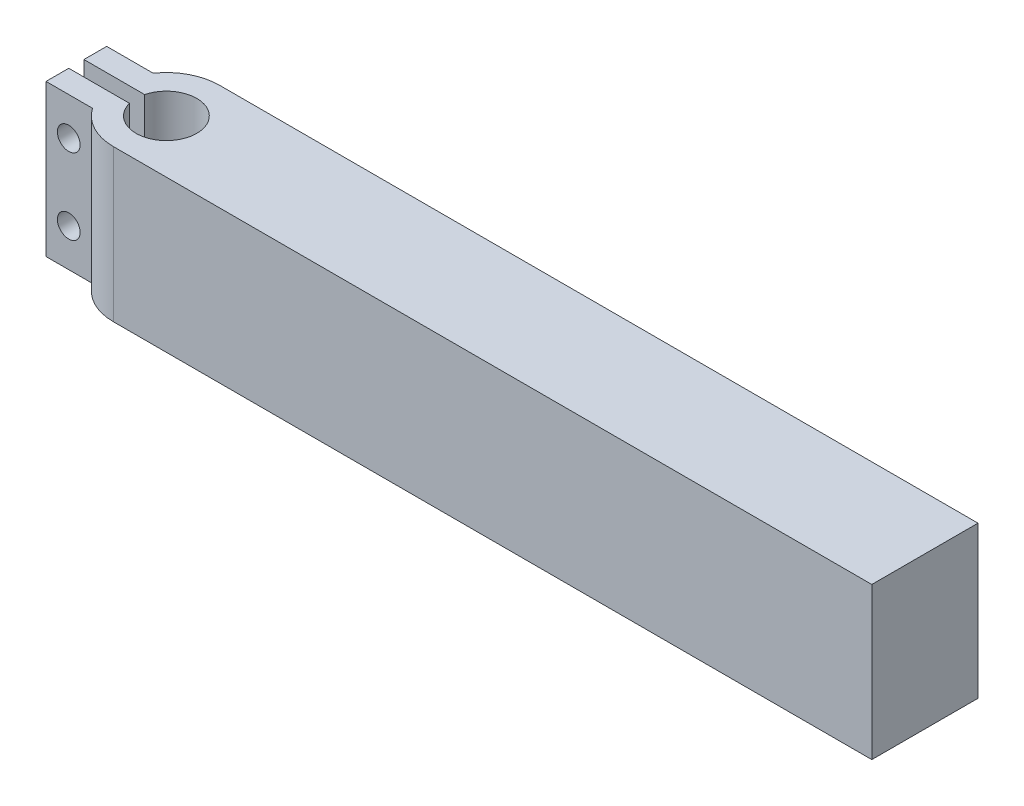
ISO-10303-21;
HEADER;
FILE_DESCRIPTION(('STEP AP214'),'2;1');
FILE_NAME('part.step','',(''),(''),'','','');
FILE_SCHEMA(('AUTOMOTIVE_DESIGN { 1 0 10303 214 1 1 1 1 }'));
ENDSEC;
DATA;
#1=APPLICATION_CONTEXT('core data for automotive mechanical design processes');
#2=APPLICATION_PROTOCOL_DEFINITION('international standard','automotive_design',2000,#1);
#3=PRODUCT_CONTEXT('',#1,'mechanical');
#4=PRODUCT('Part','Part','',(#3));
#5=PRODUCT_RELATED_PRODUCT_CATEGORY('part','',(#4));
#6=PRODUCT_DEFINITION_FORMATION('','',#4);
#7=PRODUCT_DEFINITION_CONTEXT('part definition',#1,'design');
#8=PRODUCT_DEFINITION('design','',#6,#7);
#9=PRODUCT_DEFINITION_SHAPE('','',#8);
#10=(LENGTH_UNIT() NAMED_UNIT(*) SI_UNIT(.MILLI.,.METRE.));
#11=(NAMED_UNIT(*) PLANE_ANGLE_UNIT() SI_UNIT($,.RADIAN.));
#12=(NAMED_UNIT(*) SI_UNIT($,.STERADIAN.) SOLID_ANGLE_UNIT());
#13=UNCERTAINTY_MEASURE_WITH_UNIT(LENGTH_MEASURE(1.E-05),#10,'distance_accuracy_value','');
#14=(GEOMETRIC_REPRESENTATION_CONTEXT(3) GLOBAL_UNCERTAINTY_ASSIGNED_CONTEXT((#13)) GLOBAL_UNIT_ASSIGNED_CONTEXT((#10,
#11,#12)) REPRESENTATION_CONTEXT('',''));
#15=CARTESIAN_POINT('',(0.,0.,0.));
#16=DIRECTION('',(0.,0.,1.));
#17=DIRECTION('',(1.,0.,0.));
#18=AXIS2_PLACEMENT_3D('',#15,#16,#17);
#19=CARTESIAN_POINT('',(0.,20.,-7.));
#20=DIRECTION('',(0.,-1.,0.));
#21=DIRECTION('',(0.,0.,-1.));
#22=AXIS2_PLACEMENT_3D('',#19,#20,#21);
#23=CYLINDRICAL_SURFACE('',#22,7.);
#24=CARTESIAN_POINT('',(0.,20.,-7.));
#25=DIRECTION('',(0.,1.,0.));
#26=DIRECTION('',(0.,0.,1.));
#27=AXIS2_PLACEMENT_3D('',#24,#25,#26);
#28=CIRCLE('',#27,7.);
#29=CARTESIAN_POINT('',(-5.74456264653803,20.,-3.));
#30=VERTEX_POINT('',#29);
#31=CARTESIAN_POINT('',(0.,20.,0.));
#32=VERTEX_POINT('',#31);
#33=EDGE_CURVE('E188',#30,#32,#28,.T.);
#34=ORIENTED_EDGE('',*,*,#33,.F.);
#35=DIRECTION('',(0.,-1.,0.));
#36=VECTOR('',#35,1.);
#37=CARTESIAN_POINT('',(-5.74456264653803,20.,-3.));
#38=LINE('',#37,#36);
#39=CARTESIAN_POINT('',(-5.74456264653803,0.,-3.));
#40=VERTEX_POINT('',#39);
#41=EDGE_CURVE('E153',#30,#40,#38,.T.);
#42=ORIENTED_EDGE('',*,*,#41,.T.);
#43=CARTESIAN_POINT('',(0.,0.,-7.));
#44=DIRECTION('',(0.,1.,0.));
#45=DIRECTION('',(0.,0.,1.));
#46=AXIS2_PLACEMENT_3D('',#43,#44,#45);
#47=CIRCLE('',#46,7.);
#48=CARTESIAN_POINT('',(0.,0.,0.));
#49=VERTEX_POINT('',#48);
#50=EDGE_CURVE('E200',#40,#49,#47,.T.);
#51=ORIENTED_EDGE('',*,*,#50,.T.);
#52=DIRECTION('',(0.,-1.,0.));
#53=VECTOR('',#52,1.);
#54=CARTESIAN_POINT('',(0.,20.,0.));
#55=LINE('',#54,#53);
#56=EDGE_CURVE('E212',#32,#49,#55,.T.);
#57=ORIENTED_EDGE('',*,*,#56,.F.);
#58=EDGE_LOOP('',(#34,#42,#51,#57));
#59=FACE_BOUND('',#58,.T.);
#60=ADVANCED_FACE('F35',(#59),#23,.T.);
#61=CARTESIAN_POINT('',(0.,20.,-14.));
#62=DIRECTION('',(0.,0.,-1.));
#63=DIRECTION('',(-1.,0.,0.));
#64=AXIS2_PLACEMENT_3D('',#61,#62,#63);
#65=PLANE('',#64);
#66=DIRECTION('',(1.,0.,0.));
#67=VECTOR('',#66,1.);
#68=CARTESIAN_POINT('',(0.,0.,-14.));
#69=LINE('',#68,#67);
#70=CARTESIAN_POINT('',(0.,0.,-14.));
#71=VERTEX_POINT('',#70);
#72=CARTESIAN_POINT('',(100.,0.,-14.));
#73=VERTEX_POINT('',#72);
#74=EDGE_CURVE('E182',#71,#73,#69,.T.);
#75=ORIENTED_EDGE('',*,*,#74,.F.);
#76=DIRECTION('',(0.,-1.,0.));
#77=VECTOR('',#76,1.);
#78=CARTESIAN_POINT('',(0.,20.,-14.));
#79=LINE('',#78,#77);
#80=CARTESIAN_POINT('',(0.,20.,-14.));
#81=VERTEX_POINT('',#80);
#82=EDGE_CURVE('E215',#81,#71,#79,.T.);
#83=ORIENTED_EDGE('',*,*,#82,.F.);
#84=DIRECTION('',(1.,0.,0.));
#85=VECTOR('',#84,1.);
#86=CARTESIAN_POINT('',(0.,20.,-14.));
#87=LINE('',#86,#85);
#88=CARTESIAN_POINT('',(100.,20.,-14.));
#89=VERTEX_POINT('',#88);
#90=EDGE_CURVE('E185',#81,#89,#87,.T.);
#91=ORIENTED_EDGE('',*,*,#90,.T.);
#92=DIRECTION('',(0.,-1.,0.));
#93=VECTOR('',#92,1.);
#94=CARTESIAN_POINT('',(100.,20.,-14.));
#95=LINE('',#94,#93);
#96=EDGE_CURVE('E197',#89,#73,#95,.T.);
#97=ORIENTED_EDGE('',*,*,#96,.T.);
#98=EDGE_LOOP('',(#75,#83,#91,#97));
#99=FACE_BOUND('',#98,.T.);
#100=ADVANCED_FACE('F37',(#99),#65,.T.);
#101=CARTESIAN_POINT('',(-5.74456264653803,0.,-11.));
#102=VERTEX_POINT('',#101);
#103=EDGE_CURVE('E201',#71,#102,#47,.T.);
#104=ORIENTED_EDGE('',*,*,#103,.T.);
#105=DIRECTION('',(0.,-1.,0.));
#106=VECTOR('',#105,1.);
#107=CARTESIAN_POINT('',(-5.74456264653803,20.,-11.));
#108=LINE('',#107,#106);
#109=CARTESIAN_POINT('',(-5.74456264653803,20.,-11.));
#110=VERTEX_POINT('',#109);
#111=EDGE_CURVE('E171',#102,#110,#108,.F.);
#112=ORIENTED_EDGE('',*,*,#111,.T.);
#113=EDGE_CURVE('E190',#81,#110,#28,.T.);
#114=ORIENTED_EDGE('',*,*,#113,.F.);
#115=ORIENTED_EDGE('',*,*,#82,.T.);
#116=EDGE_LOOP('',(#104,#112,#114,#115));
#117=FACE_BOUND('',#116,.T.);
#118=ADVANCED_FACE('F235',(#117),#23,.T.);
#119=CARTESIAN_POINT('',(0.,20.,0.));
#120=DIRECTION('',(0.,0.,-1.));
#121=DIRECTION('',(-1.,0.,0.));
#122=AXIS2_PLACEMENT_3D('',#119,#120,#121);
#123=PLANE('',#122);
#124=DIRECTION('',(1.,0.,0.));
#125=VECTOR('',#124,1.);
#126=CARTESIAN_POINT('',(0.,0.,0.));
#127=LINE('',#126,#125);
#128=CARTESIAN_POINT('',(100.,0.,0.));
#129=VERTEX_POINT('',#128);
#130=EDGE_CURVE('E204',#49,#129,#127,.T.);
#131=ORIENTED_EDGE('',*,*,#130,.T.);
#132=DIRECTION('',(0.,-1.,0.));
#133=VECTOR('',#132,1.);
#134=CARTESIAN_POINT('',(100.,20.,0.));
#135=LINE('',#134,#133);
#136=CARTESIAN_POINT('',(100.,20.,0.));
#137=VERTEX_POINT('',#136);
#138=EDGE_CURVE('E209',#137,#129,#135,.T.);
#139=ORIENTED_EDGE('',*,*,#138,.F.);
#140=DIRECTION('',(1.,0.,0.));
#141=VECTOR('',#140,1.);
#142=CARTESIAN_POINT('',(0.,20.,0.));
#143=LINE('',#142,#141);
#144=EDGE_CURVE('E193',#32,#137,#143,.T.);
#145=ORIENTED_EDGE('',*,*,#144,.F.);
#146=ORIENTED_EDGE('',*,*,#56,.T.);
#147=EDGE_LOOP('',(#131,#139,#145,#146));
#148=FACE_BOUND('',#147,.T.);
#149=ADVANCED_FACE('F248',(#148),#123,.F.);
#150=CARTESIAN_POINT('',(100.,20.,0.));
#151=DIRECTION('',(-1.,0.,0.));
#152=DIRECTION('',(0.,0.,1.));
#153=AXIS2_PLACEMENT_3D('',#150,#151,#152);
#154=PLANE('',#153);
#155=DIRECTION('',(0.,0.,-1.));
#156=VECTOR('',#155,1.);
#157=CARTESIAN_POINT('',(100.,0.,0.));
#158=LINE('',#157,#156);
#159=EDGE_CURVE('E189',#129,#73,#158,.T.);
#160=ORIENTED_EDGE('',*,*,#159,.T.);
#161=ORIENTED_EDGE('',*,*,#96,.F.);
#162=DIRECTION('',(0.,0.,-1.));
#163=VECTOR('',#162,1.);
#164=CARTESIAN_POINT('',(100.,20.,0.));
#165=LINE('',#164,#163);
#166=EDGE_CURVE('E195',#137,#89,#165,.T.);
#167=ORIENTED_EDGE('',*,*,#166,.F.);
#168=ORIENTED_EDGE('',*,*,#138,.T.);
#169=EDGE_LOOP('',(#160,#161,#167,#168));
#170=FACE_BOUND('',#169,.T.);
#171=ADVANCED_FACE('F243',(#170),#154,.F.);
#172=CARTESIAN_POINT('',(0.,20.,0.));
#173=DIRECTION('',(0.,1.,0.));
#174=DIRECTION('',(0.,0.,1.));
#175=AXIS2_PLACEMENT_3D('',#172,#173,#174);
#176=PLANE('',#175);
#177=CARTESIAN_POINT('',(0.,20.,-7.));
#178=DIRECTION('',(0.,1.,0.));
#179=DIRECTION('',(0.,0.,1.));
#180=AXIS2_PLACEMENT_3D('',#177,#178,#179);
#181=CIRCLE('',#180,4.);
#182=CARTESIAN_POINT('',(-3.87298334620742,20.,-6.));
#183=VERTEX_POINT('',#182);
#184=CARTESIAN_POINT('',(-3.87298334620742,20.,-8.));
#185=VERTEX_POINT('',#184);
#186=EDGE_CURVE('E131',#183,#185,#181,.T.);
#187=ORIENTED_EDGE('',*,*,#186,.F.);
#188=DIRECTION('',(1.,0.,0.));
#189=VECTOR('',#188,1.);
#190=CARTESIAN_POINT('',(-9.,20.,-6.));
#191=LINE('',#190,#189);
#192=CARTESIAN_POINT('',(-11.8729833462074,20.,-6.));
#193=VERTEX_POINT('',#192);
#194=EDGE_CURVE('E58',#193,#183,#191,.T.);
#195=ORIENTED_EDGE('',*,*,#194,.F.);
#196=DIRECTION('',(0.,0.,1.));
#197=VECTOR('',#196,1.);
#198=CARTESIAN_POINT('',(-11.8729833462074,20.,-6.));
#199=LINE('',#198,#197);
#200=CARTESIAN_POINT('',(-11.8729833462074,20.,-3.));
#201=VERTEX_POINT('',#200);
#202=EDGE_CURVE('E139',#193,#201,#199,.T.);
#203=ORIENTED_EDGE('',*,*,#202,.T.);
#204=DIRECTION('',(1.,0.,0.));
#205=VECTOR('',#204,1.);
#206=CARTESIAN_POINT('',(-3.87298334620742,20.,-3.));
#207=LINE('',#206,#205);
#208=EDGE_CURVE('E50',#201,#30,#207,.T.);
#209=ORIENTED_EDGE('',*,*,#208,.T.);
#210=ORIENTED_EDGE('',*,*,#33,.T.);
#211=ORIENTED_EDGE('',*,*,#144,.T.);
#212=ORIENTED_EDGE('',*,*,#166,.T.);
#213=ORIENTED_EDGE('',*,*,#90,.F.);
#214=ORIENTED_EDGE('',*,*,#113,.T.);
#215=DIRECTION('',(-1.,0.,0.));
#216=VECTOR('',#215,1.);
#217=CARTESIAN_POINT('',(-3.87298334620742,20.,-11.));
#218=LINE('',#217,#216);
#219=CARTESIAN_POINT('',(-11.8729833462074,20.,-11.));
#220=VERTEX_POINT('',#219);
#221=EDGE_CURVE('E157',#110,#220,#218,.T.);
#222=ORIENTED_EDGE('',*,*,#221,.T.);
#223=DIRECTION('',(0.,0.,1.));
#224=VECTOR('',#223,1.);
#225=CARTESIAN_POINT('',(-11.8729833462074,20.,-8.));
#226=LINE('',#225,#224);
#227=CARTESIAN_POINT('',(-11.8729833462074,20.,-8.));
#228=VERTEX_POINT('',#227);
#229=EDGE_CURVE('E161',#220,#228,#226,.T.);
#230=ORIENTED_EDGE('',*,*,#229,.T.);
#231=DIRECTION('',(-1.,0.,0.));
#232=VECTOR('',#231,1.);
#233=CARTESIAN_POINT('',(-9.,20.,-8.));
#234=LINE('',#233,#232);
#235=EDGE_CURVE('E176',#185,#228,#234,.T.);
#236=ORIENTED_EDGE('',*,*,#235,.F.);
#237=EDGE_LOOP('',(#187,#195,#203,#209,#210,#211,#212,#213,#214,#222,#230,#236));
#238=FACE_BOUND('',#237,.T.);
#239=ADVANCED_FACE('F254',(#238),#176,.T.);
#240=CARTESIAN_POINT('',(0.,0.,0.));
#241=DIRECTION('',(0.,1.,0.));
#242=DIRECTION('',(0.,0.,1.));
#243=AXIS2_PLACEMENT_3D('',#240,#241,#242);
#244=PLANE('',#243);
#245=DIRECTION('',(1.,0.,0.));
#246=VECTOR('',#245,1.);
#247=CARTESIAN_POINT('',(-9.,0.,-6.));
#248=LINE('',#247,#246);
#249=CARTESIAN_POINT('',(-11.8729833462074,0.,-6.));
#250=VERTEX_POINT('',#249);
#251=CARTESIAN_POINT('',(-3.87298334620742,0.,-6.));
#252=VERTEX_POINT('',#251);
#253=EDGE_CURVE('E122',#250,#252,#248,.T.);
#254=ORIENTED_EDGE('',*,*,#253,.T.);
#255=CARTESIAN_POINT('',(0.,0.,-7.));
#256=DIRECTION('',(0.,1.,0.));
#257=DIRECTION('',(0.,0.,1.));
#258=AXIS2_PLACEMENT_3D('',#255,#256,#257);
#259=CIRCLE('',#258,4.);
#260=CARTESIAN_POINT('',(-3.87298334620742,0.,-8.));
#261=VERTEX_POINT('',#260);
#262=EDGE_CURVE('E180',#252,#261,#259,.T.);
#263=ORIENTED_EDGE('',*,*,#262,.T.);
#264=DIRECTION('',(-1.,0.,0.));
#265=VECTOR('',#264,1.);
#266=CARTESIAN_POINT('',(-9.,0.,-8.));
#267=LINE('',#266,#265);
#268=CARTESIAN_POINT('',(-11.8729833462074,0.,-8.));
#269=VERTEX_POINT('',#268);
#270=EDGE_CURVE('E132',#261,#269,#267,.T.);
#271=ORIENTED_EDGE('',*,*,#270,.T.);
#272=DIRECTION('',(0.,0.,1.));
#273=VECTOR('',#272,1.);
#274=CARTESIAN_POINT('',(-11.8729833462074,0.,-8.));
#275=LINE('',#274,#273);
#276=CARTESIAN_POINT('',(-11.8729833462074,0.,-11.));
#277=VERTEX_POINT('',#276);
#278=EDGE_CURVE('E160',#277,#269,#275,.T.);
#279=ORIENTED_EDGE('',*,*,#278,.F.);
#280=DIRECTION('',(-1.,0.,0.));
#281=VECTOR('',#280,1.);
#282=CARTESIAN_POINT('',(-3.87298334620742,0.,-11.));
#283=LINE('',#282,#281);
#284=EDGE_CURVE('E158',#102,#277,#283,.T.);
#285=ORIENTED_EDGE('',*,*,#284,.F.);
#286=ORIENTED_EDGE('',*,*,#103,.F.);
#287=ORIENTED_EDGE('',*,*,#74,.T.);
#288=ORIENTED_EDGE('',*,*,#159,.F.);
#289=ORIENTED_EDGE('',*,*,#130,.F.);
#290=ORIENTED_EDGE('',*,*,#50,.F.);
#291=DIRECTION('',(1.,0.,0.));
#292=VECTOR('',#291,1.);
#293=CARTESIAN_POINT('',(-3.87298334620742,0.,-3.));
#294=LINE('',#293,#292);
#295=CARTESIAN_POINT('',(-11.8729833462074,0.,-3.));
#296=VERTEX_POINT('',#295);
#297=EDGE_CURVE('E141',#296,#40,#294,.T.);
#298=ORIENTED_EDGE('',*,*,#297,.F.);
#299=DIRECTION('',(0.,0.,1.));
#300=VECTOR('',#299,1.);
#301=CARTESIAN_POINT('',(-11.8729833462074,0.,-6.));
#302=LINE('',#301,#300);
#303=EDGE_CURVE('E137',#250,#296,#302,.T.);
#304=ORIENTED_EDGE('',*,*,#303,.F.);
#305=EDGE_LOOP('',(#254,#263,#271,#279,#285,#286,#287,#288,#289,#290,#298,#304));
#306=FACE_BOUND('',#305,.T.);
#307=ADVANCED_FACE('F143',(#306),#244,.F.);
#308=CARTESIAN_POINT('',(0.,0.,-7.));
#309=DIRECTION('',(0.,1.,0.));
#310=DIRECTION('',(0.,0.,1.));
#311=AXIS2_PLACEMENT_3D('',#308,#309,#310);
#312=CYLINDRICAL_SURFACE('',#311,4.);
#313=ORIENTED_EDGE('',*,*,#262,.F.);
#314=DIRECTION('',(0.,1.,0.));
#315=VECTOR('',#314,1.);
#316=CARTESIAN_POINT('',(-3.87298334620742,0.,-6.));
#317=LINE('',#316,#315);
#318=EDGE_CURVE('E11',#252,#183,#317,.T.);
#319=ORIENTED_EDGE('',*,*,#318,.T.);
#320=ORIENTED_EDGE('',*,*,#186,.T.);
#321=DIRECTION('',(0.,1.,0.));
#322=VECTOR('',#321,1.);
#323=CARTESIAN_POINT('',(-3.87298334620742,0.,-8.));
#324=LINE('',#323,#322);
#325=EDGE_CURVE('E43',#185,#261,#324,.F.);
#326=ORIENTED_EDGE('',*,*,#325,.T.);
#327=EDGE_LOOP('',(#313,#319,#320,#326));
#328=FACE_BOUND('',#327,.T.);
#329=ADVANCED_FACE('F218',(#328),#312,.F.);
#330=CARTESIAN_POINT('',(-9.,0.,-8.));
#331=DIRECTION('',(0.,0.,-1.));
#332=DIRECTION('',(-1.,0.,0.));
#333=AXIS2_PLACEMENT_3D('',#330,#331,#332);
#334=PLANE('',#333);
#335=CARTESIAN_POINT('',(-8.87298334620742,5.,-8.));
#336=DIRECTION('',(0.,0.,-1.));
#337=DIRECTION('',(-1.,0.,0.));
#338=AXIS2_PLACEMENT_3D('',#335,#336,#337);
#339=CIRCLE('',#338,1.5);
#340=CARTESIAN_POINT('',(-10.3729833462074,5.,-8.));
#341=VERTEX_POINT('',#340);
#342=EDGE_CURVE('E422',#341,#341,#339,.T.);
#343=ORIENTED_EDGE('',*,*,#342,.T.);
#344=EDGE_LOOP('',(#343));
#345=FACE_BOUND('',#344,.T.);
#346=CARTESIAN_POINT('',(-8.87298334620742,15.,-8.));
#347=DIRECTION('',(0.,0.,-1.));
#348=DIRECTION('',(-1.,0.,0.));
#349=AXIS2_PLACEMENT_3D('',#346,#347,#348);
#350=CIRCLE('',#349,1.5);
#351=CARTESIAN_POINT('',(-10.3729833462074,15.,-8.));
#352=VERTEX_POINT('',#351);
#353=EDGE_CURVE('E149',#352,#352,#350,.T.);
#354=ORIENTED_EDGE('',*,*,#353,.T.);
#355=EDGE_LOOP('',(#354));
#356=FACE_BOUND('',#355,.T.);
#357=ORIENTED_EDGE('',*,*,#270,.F.);
#358=ORIENTED_EDGE('',*,*,#325,.F.);
#359=ORIENTED_EDGE('',*,*,#235,.T.);
#360=DIRECTION('',(0.,1.,0.));
#361=VECTOR('',#360,1.);
#362=CARTESIAN_POINT('',(-11.8729833462074,0.,-8.));
#363=LINE('',#362,#361);
#364=EDGE_CURVE('E168',#269,#228,#363,.T.);
#365=ORIENTED_EDGE('',*,*,#364,.F.);
#366=EDGE_LOOP('',(#357,#358,#359,#365));
#367=FACE_BOUND('',#366,.T.);
#368=ADVANCED_FACE('F225',(#345,#356,#367),#334,.F.);
#369=CARTESIAN_POINT('',(-9.,0.,-6.));
#370=DIRECTION('',(0.,0.,1.));
#371=DIRECTION('',(1.,0.,0.));
#372=AXIS2_PLACEMENT_3D('',#369,#370,#371);
#373=PLANE('',#372);
#374=CARTESIAN_POINT('',(-8.87298334620742,5.,-6.));
#375=DIRECTION('',(0.,0.,1.));
#376=DIRECTION('',(1.,0.,0.));
#377=AXIS2_PLACEMENT_3D('',#374,#375,#376);
#378=CIRCLE('',#377,1.5);
#379=CARTESIAN_POINT('',(-7.37298334620742,5.,-6.));
#380=VERTEX_POINT('',#379);
#381=EDGE_CURVE('E424',#380,#380,#378,.T.);
#382=ORIENTED_EDGE('',*,*,#381,.T.);
#383=EDGE_LOOP('',(#382));
#384=FACE_BOUND('',#383,.T.);
#385=CARTESIAN_POINT('',(-8.87298334620742,15.,-6.));
#386=DIRECTION('',(0.,0.,1.));
#387=DIRECTION('',(1.,0.,0.));
#388=AXIS2_PLACEMENT_3D('',#385,#386,#387);
#389=CIRCLE('',#388,1.5);
#390=CARTESIAN_POINT('',(-7.37298334620742,15.,-6.));
#391=VERTEX_POINT('',#390);
#392=EDGE_CURVE('E434',#391,#391,#389,.T.);
#393=ORIENTED_EDGE('',*,*,#392,.T.);
#394=EDGE_LOOP('',(#393));
#395=FACE_BOUND('',#394,.T.);
#396=ORIENTED_EDGE('',*,*,#194,.T.);
#397=ORIENTED_EDGE('',*,*,#318,.F.);
#398=ORIENTED_EDGE('',*,*,#253,.F.);
#399=DIRECTION('',(0.,1.,0.));
#400=VECTOR('',#399,1.);
#401=CARTESIAN_POINT('',(-11.8729833462074,0.,-6.));
#402=LINE('',#401,#400);
#403=EDGE_CURVE('E125',#250,#193,#402,.T.);
#404=ORIENTED_EDGE('',*,*,#403,.T.);
#405=EDGE_LOOP('',(#396,#397,#398,#404));
#406=FACE_BOUND('',#405,.T.);
#407=ADVANCED_FACE('F124',(#384,#395,#406),#373,.F.);
#408=CARTESIAN_POINT('',(-3.87298334620742,0.,-11.));
#409=DIRECTION('',(0.,0.,-1.));
#410=DIRECTION('',(-1.,0.,0.));
#411=AXIS2_PLACEMENT_3D('',#408,#409,#410);
#412=PLANE('',#411);
#413=CARTESIAN_POINT('',(-8.87298334620742,5.,-11.));
#414=DIRECTION('',(0.,0.,-1.));
#415=DIRECTION('',(-1.,0.,0.));
#416=AXIS2_PLACEMENT_3D('',#413,#414,#415);
#417=CIRCLE('',#416,1.5);
#418=CARTESIAN_POINT('',(-10.3729833462074,5.,-11.));
#419=VERTEX_POINT('',#418);
#420=EDGE_CURVE('E419',#419,#419,#417,.T.);
#421=ORIENTED_EDGE('',*,*,#420,.F.);
#422=EDGE_LOOP('',(#421));
#423=FACE_BOUND('',#422,.T.);
#424=CARTESIAN_POINT('',(-8.87298334620742,15.,-11.));
#425=DIRECTION('',(0.,0.,-1.));
#426=DIRECTION('',(-1.,0.,0.));
#427=AXIS2_PLACEMENT_3D('',#424,#425,#426);
#428=CIRCLE('',#427,1.5);
#429=CARTESIAN_POINT('',(-10.3729833462074,15.,-11.));
#430=VERTEX_POINT('',#429);
#431=EDGE_CURVE('E427',#430,#430,#428,.T.);
#432=ORIENTED_EDGE('',*,*,#431,.F.);
#433=EDGE_LOOP('',(#432));
#434=FACE_BOUND('',#433,.T.);
#435=ORIENTED_EDGE('',*,*,#111,.F.);
#436=ORIENTED_EDGE('',*,*,#284,.T.);
#437=DIRECTION('',(0.,1.,0.));
#438=VECTOR('',#437,1.);
#439=CARTESIAN_POINT('',(-11.8729833462074,0.,-11.));
#440=LINE('',#439,#438);
#441=EDGE_CURVE('E164',#277,#220,#440,.T.);
#442=ORIENTED_EDGE('',*,*,#441,.T.);
#443=ORIENTED_EDGE('',*,*,#221,.F.);
#444=EDGE_LOOP('',(#435,#436,#442,#443));
#445=FACE_BOUND('',#444,.T.);
#446=ADVANCED_FACE('F231',(#423,#434,#445),#412,.T.);
#447=CARTESIAN_POINT('',(-11.8729833462074,0.,-8.));
#448=DIRECTION('',(-1.,0.,0.));
#449=DIRECTION('',(0.,0.,1.));
#450=AXIS2_PLACEMENT_3D('',#447,#448,#449);
#451=PLANE('',#450);
#452=ORIENTED_EDGE('',*,*,#229,.F.);
#453=ORIENTED_EDGE('',*,*,#441,.F.);
#454=ORIENTED_EDGE('',*,*,#278,.T.);
#455=ORIENTED_EDGE('',*,*,#364,.T.);
#456=EDGE_LOOP('',(#452,#453,#454,#455));
#457=FACE_BOUND('',#456,.T.);
#458=ADVANCED_FACE('F229',(#457),#451,.T.);
#459=CARTESIAN_POINT('',(-3.87298334620742,0.,-3.));
#460=DIRECTION('',(0.,0.,1.));
#461=DIRECTION('',(1.,0.,0.));
#462=AXIS2_PLACEMENT_3D('',#459,#460,#461);
#463=PLANE('',#462);
#464=CARTESIAN_POINT('',(-8.87298334620742,5.,-3.));
#465=DIRECTION('',(0.,0.,1.));
#466=DIRECTION('',(1.,0.,0.));
#467=AXIS2_PLACEMENT_3D('',#464,#465,#466);
#468=CIRCLE('',#467,1.5);
#469=CARTESIAN_POINT('',(-7.37298334620742,5.,-3.));
#470=VERTEX_POINT('',#469);
#471=EDGE_CURVE('E446',#470,#470,#468,.T.);
#472=ORIENTED_EDGE('',*,*,#471,.F.);
#473=EDGE_LOOP('',(#472));
#474=FACE_BOUND('',#473,.T.);
#475=CARTESIAN_POINT('',(-8.87298334620742,15.,-3.));
#476=DIRECTION('',(0.,0.,1.));
#477=DIRECTION('',(1.,0.,0.));
#478=AXIS2_PLACEMENT_3D('',#475,#476,#477);
#479=CIRCLE('',#478,1.5);
#480=CARTESIAN_POINT('',(-7.37298334620742,15.,-3.));
#481=VERTEX_POINT('',#480);
#482=EDGE_CURVE('E423',#481,#481,#479,.T.);
#483=ORIENTED_EDGE('',*,*,#482,.F.);
#484=EDGE_LOOP('',(#483));
#485=FACE_BOUND('',#484,.T.);
#486=ORIENTED_EDGE('',*,*,#41,.F.);
#487=ORIENTED_EDGE('',*,*,#208,.F.);
#488=DIRECTION('',(0.,1.,0.));
#489=VECTOR('',#488,1.);
#490=CARTESIAN_POINT('',(-11.8729833462074,0.,-3.));
#491=LINE('',#490,#489);
#492=EDGE_CURVE('E140',#296,#201,#491,.T.);
#493=ORIENTED_EDGE('',*,*,#492,.F.);
#494=ORIENTED_EDGE('',*,*,#297,.T.);
#495=EDGE_LOOP('',(#486,#487,#493,#494));
#496=FACE_BOUND('',#495,.T.);
#497=ADVANCED_FACE('F253',(#474,#485,#496),#463,.T.);
#498=CARTESIAN_POINT('',(-11.8729833462074,0.,-6.));
#499=DIRECTION('',(-1.,0.,0.));
#500=DIRECTION('',(0.,0.,1.));
#501=AXIS2_PLACEMENT_3D('',#498,#499,#500);
#502=PLANE('',#501);
#503=ORIENTED_EDGE('',*,*,#202,.F.);
#504=ORIENTED_EDGE('',*,*,#403,.F.);
#505=ORIENTED_EDGE('',*,*,#303,.T.);
#506=ORIENTED_EDGE('',*,*,#492,.T.);
#507=EDGE_LOOP('',(#503,#504,#505,#506));
#508=FACE_BOUND('',#507,.T.);
#509=ADVANCED_FACE('F136',(#508),#502,.T.);
#510=CARTESIAN_POINT('',(-8.87298334620742,15.,-23.));
#511=DIRECTION('',(0.,0.,1.));
#512=DIRECTION('',(1.,0.,0.));
#513=AXIS2_PLACEMENT_3D('',#510,#511,#512);
#514=CYLINDRICAL_SURFACE('',#513,1.5);
#515=ORIENTED_EDGE('',*,*,#482,.T.);
#516=EDGE_LOOP('',(#515));
#517=FACE_BOUND('',#516,.T.);
#518=ORIENTED_EDGE('',*,*,#392,.F.);
#519=EDGE_LOOP('',(#518));
#520=FACE_BOUND('',#519,.T.);
#521=ADVANCED_FACE('F356',(#517,#520),#514,.F.);
#522=ORIENTED_EDGE('',*,*,#431,.T.);
#523=EDGE_LOOP('',(#522));
#524=FACE_BOUND('',#523,.T.);
#525=ORIENTED_EDGE('',*,*,#353,.F.);
#526=EDGE_LOOP('',(#525));
#527=FACE_BOUND('',#526,.T.);
#528=ADVANCED_FACE('F384',(#524,#527),#514,.F.);
#529=CARTESIAN_POINT('',(-8.87298334620742,5.,-23.));
#530=DIRECTION('',(0.,0.,1.));
#531=DIRECTION('',(1.,0.,0.));
#532=AXIS2_PLACEMENT_3D('',#529,#530,#531);
#533=CYLINDRICAL_SURFACE('',#532,1.5);
#534=ORIENTED_EDGE('',*,*,#471,.T.);
#535=EDGE_LOOP('',(#534));
#536=FACE_BOUND('',#535,.T.);
#537=ORIENTED_EDGE('',*,*,#381,.F.);
#538=EDGE_LOOP('',(#537));
#539=FACE_BOUND('',#538,.T.);
#540=ADVANCED_FACE('F394',(#536,#539),#533,.F.);
#541=ORIENTED_EDGE('',*,*,#420,.T.);
#542=EDGE_LOOP('',(#541));
#543=FACE_BOUND('',#542,.T.);
#544=ORIENTED_EDGE('',*,*,#342,.F.);
#545=EDGE_LOOP('',(#544));
#546=FACE_BOUND('',#545,.T.);
#547=ADVANCED_FACE('F403',(#543,#546),#533,.F.);
#548=CLOSED_SHELL('',(#60,#100,#118,#149,#171,#239,#307,#329,#368,#407,#446,#458,#497,#509,#521,
#528,#540,#547));
#549=MANIFOLD_SOLID_BREP('B2',#548);
#550=ADVANCED_BREP_SHAPE_REPRESENTATION('',(#18,#549),#14);
#551=SHAPE_DEFINITION_REPRESENTATION(#9,#550);
ENDSEC;
END-ISO-10303-21;
